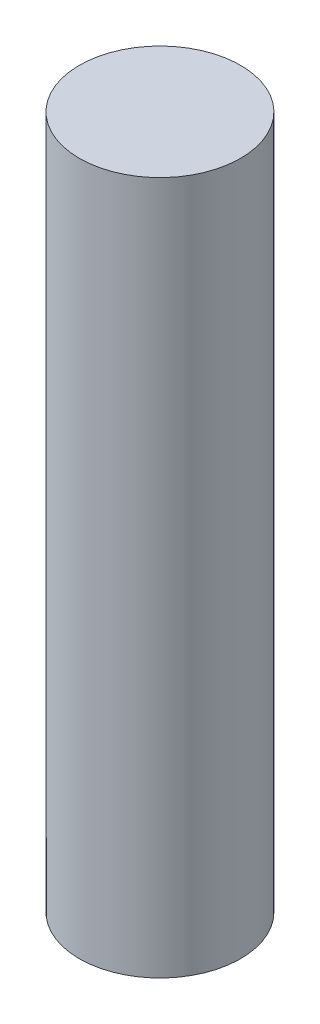
ISO-10303-21;
HEADER;
FILE_DESCRIPTION(('STEP AP214'),'2;1');
FILE_NAME('part.step','',(''),(''),'','','');
FILE_SCHEMA(('AUTOMOTIVE_DESIGN { 1 0 10303 214 1 1 1 1 }'));
ENDSEC;
DATA;
#1=APPLICATION_CONTEXT('core data for automotive mechanical design processes');
#2=APPLICATION_PROTOCOL_DEFINITION('international standard','automotive_design',2000,#1);
#3=PRODUCT_CONTEXT('',#1,'mechanical');
#4=PRODUCT('Part','Part','',(#3));
#5=PRODUCT_RELATED_PRODUCT_CATEGORY('part','',(#4));
#6=PRODUCT_DEFINITION_FORMATION('','',#4);
#7=PRODUCT_DEFINITION_CONTEXT('part definition',#1,'design');
#8=PRODUCT_DEFINITION('design','',#6,#7);
#9=PRODUCT_DEFINITION_SHAPE('','',#8);
#10=(LENGTH_UNIT() NAMED_UNIT(*) SI_UNIT(.MILLI.,.METRE.));
#11=(NAMED_UNIT(*) PLANE_ANGLE_UNIT() SI_UNIT($,.RADIAN.));
#12=(NAMED_UNIT(*) SI_UNIT($,.STERADIAN.) SOLID_ANGLE_UNIT());
#13=UNCERTAINTY_MEASURE_WITH_UNIT(LENGTH_MEASURE(1.E-05),#10,'distance_accuracy_value','');
#14=(GEOMETRIC_REPRESENTATION_CONTEXT(3) GLOBAL_UNCERTAINTY_ASSIGNED_CONTEXT((#13)) GLOBAL_UNIT_ASSIGNED_CONTEXT((#10,
#11,#12)) REPRESENTATION_CONTEXT('',''));
#15=CARTESIAN_POINT('',(0.,0.,0.));
#16=DIRECTION('',(0.,0.,1.));
#17=DIRECTION('',(1.,0.,0.));
#18=AXIS2_PLACEMENT_3D('',#15,#16,#17);
#19=CARTESIAN_POINT('',(0.,43.,0.));
#20=DIRECTION('',(0.,-1.,0.));
#21=DIRECTION('',(0.,0.,-1.));
#22=AXIS2_PLACEMENT_3D('',#19,#20,#21);
#23=CYLINDRICAL_SURFACE('',#22,5.);
#24=CARTESIAN_POINT('',(0.,43.,0.));
#25=DIRECTION('',(0.,1.,0.));
#26=DIRECTION('',(0.,0.,1.));
#27=AXIS2_PLACEMENT_3D('',#24,#25,#26);
#28=CIRCLE('',#27,5.);
#29=CARTESIAN_POINT('',(0.,43.,5.));
#30=VERTEX_POINT('',#29);
#31=EDGE_CURVE('E10',#30,#30,#28,.T.);
#32=ORIENTED_EDGE('',*,*,#31,.F.);
#33=EDGE_LOOP('',(#32));
#34=FACE_BOUND('',#33,.T.);
#35=CARTESIAN_POINT('',(0.,0.,0.));
#36=DIRECTION('',(0.,1.,0.));
#37=DIRECTION('',(0.,0.,1.));
#38=AXIS2_PLACEMENT_3D('',#35,#36,#37);
#39=CIRCLE('',#38,5.);
#40=CARTESIAN_POINT('',(0.,0.,5.));
#41=VERTEX_POINT('',#40);
#42=EDGE_CURVE('E40',#41,#41,#39,.T.);
#43=ORIENTED_EDGE('',*,*,#42,.T.);
#44=EDGE_LOOP('',(#43));
#45=FACE_BOUND('',#44,.T.);
#46=ADVANCED_FACE('F37',(#34,#45),#23,.T.);
#47=CARTESIAN_POINT('',(0.,43.,0.));
#48=DIRECTION('',(0.,1.,0.));
#49=DIRECTION('',(0.,0.,1.));
#50=AXIS2_PLACEMENT_3D('',#47,#48,#49);
#51=PLANE('',#50);
#52=ORIENTED_EDGE('',*,*,#31,.T.);
#53=EDGE_LOOP('',(#52));
#54=FACE_BOUND('',#53,.T.);
#55=ADVANCED_FACE('F54',(#54),#51,.T.);
#56=CARTESIAN_POINT('',(0.,0.,0.));
#57=DIRECTION('',(0.,1.,0.));
#58=DIRECTION('',(0.,0.,1.));
#59=AXIS2_PLACEMENT_3D('',#56,#57,#58);
#60=PLANE('',#59);
#61=ORIENTED_EDGE('',*,*,#42,.F.);
#62=EDGE_LOOP('',(#61));
#63=FACE_BOUND('',#62,.T.);
#64=ADVANCED_FACE('F52',(#63),#60,.F.);
#65=CLOSED_SHELL('',(#46,#55,#64));
#66=MANIFOLD_SOLID_BREP('B2',#65);
#67=ADVANCED_BREP_SHAPE_REPRESENTATION('',(#18,#66),#14);
#68=SHAPE_DEFINITION_REPRESENTATION(#9,#67);
ENDSEC;
END-ISO-10303-21;
